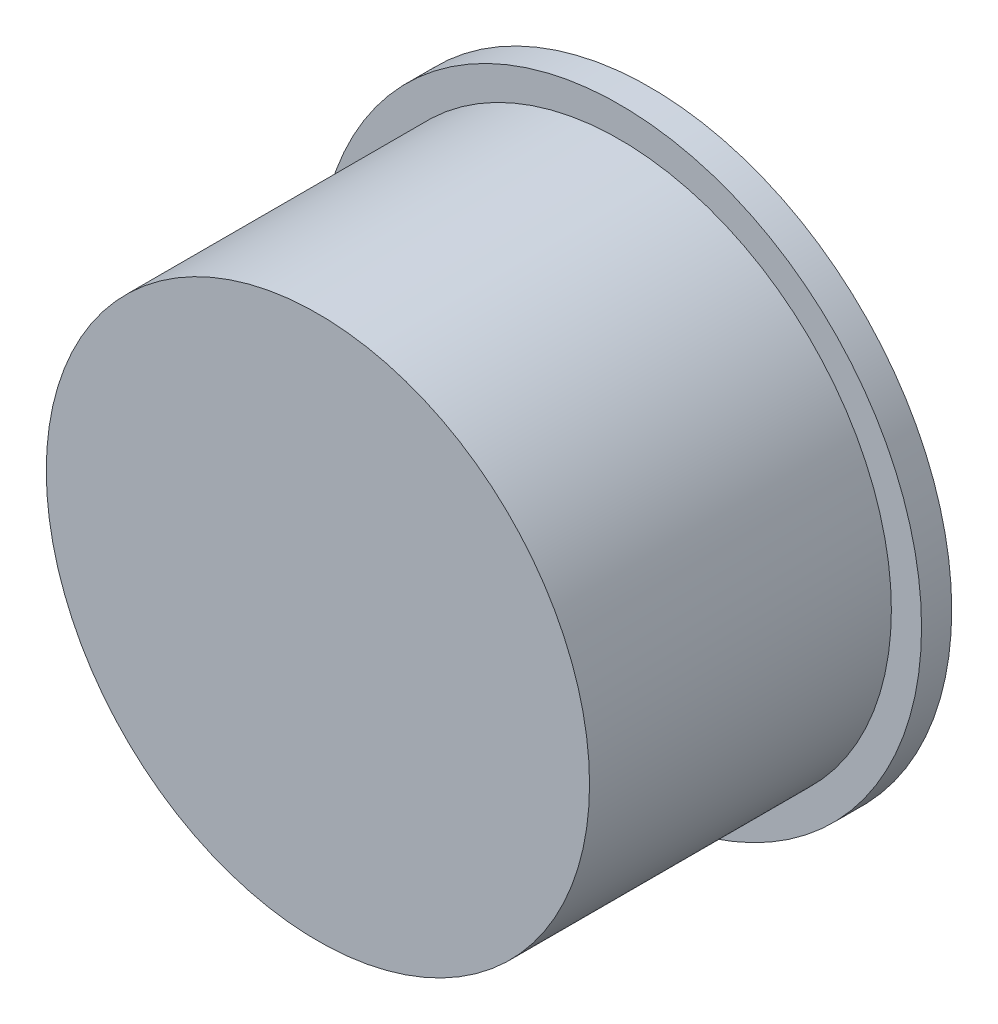
ISO-10303-21;
HEADER;
FILE_DESCRIPTION(('STEP AP214'),'2;1');
FILE_NAME('part.step','',(''),(''),'','','');
FILE_SCHEMA(('AUTOMOTIVE_DESIGN { 1 0 10303 214 1 1 1 1 }'));
ENDSEC;
DATA;
#1=APPLICATION_CONTEXT('core data for automotive mechanical design processes');
#2=APPLICATION_PROTOCOL_DEFINITION('international standard','automotive_design',2000,#1);
#3=PRODUCT_CONTEXT('',#1,'mechanical');
#4=PRODUCT('Part','Part','',(#3));
#5=PRODUCT_RELATED_PRODUCT_CATEGORY('part','',(#4));
#6=PRODUCT_DEFINITION_FORMATION('','',#4);
#7=PRODUCT_DEFINITION_CONTEXT('part definition',#1,'design');
#8=PRODUCT_DEFINITION('design','',#6,#7);
#9=PRODUCT_DEFINITION_SHAPE('','',#8);
#10=(LENGTH_UNIT() NAMED_UNIT(*) SI_UNIT(.MILLI.,.METRE.));
#11=(NAMED_UNIT(*) PLANE_ANGLE_UNIT() SI_UNIT($,.RADIAN.));
#12=(NAMED_UNIT(*) SI_UNIT($,.STERADIAN.) SOLID_ANGLE_UNIT());
#13=UNCERTAINTY_MEASURE_WITH_UNIT(LENGTH_MEASURE(1.E-05),#10,'distance_accuracy_value','');
#14=(GEOMETRIC_REPRESENTATION_CONTEXT(3) GLOBAL_UNCERTAINTY_ASSIGNED_CONTEXT((#13)) GLOBAL_UNIT_ASSIGNED_CONTEXT((#10,
#11,#12)) REPRESENTATION_CONTEXT('',''));
#15=CARTESIAN_POINT('',(0.,0.,0.));
#16=DIRECTION('',(0.,0.,1.));
#17=DIRECTION('',(1.,0.,0.));
#18=AXIS2_PLACEMENT_3D('',#15,#16,#17);
#19=CARTESIAN_POINT('',(0.,0.,5.08));
#20=DIRECTION('',(0.,0.,-1.));
#21=DIRECTION('',(-1.,0.,0.));
#22=AXIS2_PLACEMENT_3D('',#19,#20,#21);
#23=CYLINDRICAL_SURFACE('',#22,17.78);
#24=CARTESIAN_POINT('',(0.,0.,5.08));
#25=DIRECTION('',(0.,0.,1.));
#26=DIRECTION('',(1.,0.,0.));
#27=AXIS2_PLACEMENT_3D('',#24,#25,#26);
#28=CIRCLE('',#27,17.78);
#29=CARTESIAN_POINT('',(17.78,0.,5.08));
#30=VERTEX_POINT('',#29);
#31=EDGE_CURVE('E45',#30,#30,#28,.T.);
#32=ORIENTED_EDGE('',*,*,#31,.F.);
#33=EDGE_LOOP('',(#32));
#34=FACE_BOUND('',#33,.T.);
#35=CARTESIAN_POINT('',(0.,0.,0.));
#36=DIRECTION('',(0.,0.,1.));
#37=DIRECTION('',(1.,0.,0.));
#38=AXIS2_PLACEMENT_3D('',#35,#36,#37);
#39=CIRCLE('',#38,17.78);
#40=CARTESIAN_POINT('',(17.78,0.,0.));
#41=VERTEX_POINT('',#40);
#42=EDGE_CURVE('E40',#41,#41,#39,.T.);
#43=ORIENTED_EDGE('',*,*,#42,.T.);
#44=EDGE_LOOP('',(#43));
#45=FACE_BOUND('',#44,.T.);
#46=ADVANCED_FACE('F37',(#34,#45),#23,.T.);
#47=CARTESIAN_POINT('',(0.,0.,0.));
#48=DIRECTION('',(0.,0.,1.));
#49=DIRECTION('',(1.,0.,0.));
#50=AXIS2_PLACEMENT_3D('',#47,#48,#49);
#51=PLANE('',#50);
#52=ORIENTED_EDGE('',*,*,#42,.F.);
#53=EDGE_LOOP('',(#52));
#54=FACE_BOUND('',#53,.T.);
#55=ADVANCED_FACE('F83',(#54),#51,.F.);
#56=CARTESIAN_POINT('',(0.,0.,10.16));
#57=DIRECTION('',(0.,0.,-1.));
#58=DIRECTION('',(-1.,0.,0.));
#59=AXIS2_PLACEMENT_3D('',#56,#57,#58);
#60=CYLINDRICAL_SURFACE('',#59,50.8);
#61=CARTESIAN_POINT('',(0.,0.,10.16));
#62=DIRECTION('',(0.,0.,1.));
#63=DIRECTION('',(1.,0.,0.));
#64=AXIS2_PLACEMENT_3D('',#61,#62,#63);
#65=CIRCLE('',#64,50.8);
#66=CARTESIAN_POINT('',(50.8,0.,10.16));
#67=VERTEX_POINT('',#66);
#68=EDGE_CURVE('E54',#67,#67,#65,.T.);
#69=ORIENTED_EDGE('',*,*,#68,.F.);
#70=EDGE_LOOP('',(#69));
#71=FACE_BOUND('',#70,.T.);
#72=CARTESIAN_POINT('',(0.,0.,5.08));
#73=DIRECTION('',(0.,0.,1.));
#74=DIRECTION('',(1.,0.,0.));
#75=AXIS2_PLACEMENT_3D('',#72,#73,#74);
#76=CIRCLE('',#75,50.8);
#77=CARTESIAN_POINT('',(50.8,0.,5.08));
#78=VERTEX_POINT('',#77);
#79=EDGE_CURVE('E58',#78,#78,#76,.T.);
#80=ORIENTED_EDGE('',*,*,#79,.T.);
#81=EDGE_LOOP('',(#80));
#82=FACE_BOUND('',#81,.T.);
#83=ADVANCED_FACE('F88',(#71,#82),#60,.T.);
#84=CARTESIAN_POINT('',(0.,0.,10.16));
#85=DIRECTION('',(0.,0.,1.));
#86=DIRECTION('',(1.,0.,0.));
#87=AXIS2_PLACEMENT_3D('',#84,#85,#86);
#88=PLANE('',#87);
#89=CARTESIAN_POINT('',(0.,0.,10.16));
#90=DIRECTION('',(0.,0.,1.));
#91=DIRECTION('',(1.,0.,0.));
#92=AXIS2_PLACEMENT_3D('',#89,#90,#91);
#93=CIRCLE('',#92,45.72);
#94=CARTESIAN_POINT('',(45.72,0.,10.16));
#95=VERTEX_POINT('',#94);
#96=EDGE_CURVE('E10',#95,#95,#93,.T.);
#97=ORIENTED_EDGE('',*,*,#96,.F.);
#98=EDGE_LOOP('',(#97));
#99=FACE_BOUND('',#98,.T.);
#100=ORIENTED_EDGE('',*,*,#68,.T.);
#101=EDGE_LOOP('',(#100));
#102=FACE_BOUND('',#101,.T.);
#103=ADVANCED_FACE('F78',(#99,#102),#88,.T.);
#104=CARTESIAN_POINT('',(0.,0.,5.08));
#105=DIRECTION('',(0.,0.,1.));
#106=DIRECTION('',(1.,0.,0.));
#107=AXIS2_PLACEMENT_3D('',#104,#105,#106);
#108=PLANE('',#107);
#109=ORIENTED_EDGE('',*,*,#31,.T.);
#110=EDGE_LOOP('',(#109));
#111=FACE_BOUND('',#110,.T.);
#112=ORIENTED_EDGE('',*,*,#79,.F.);
#113=EDGE_LOOP('',(#112));
#114=FACE_BOUND('',#113,.T.);
#115=ADVANCED_FACE('F71',(#111,#114),#108,.F.);
#116=CARTESIAN_POINT('',(0.,0.,60.96));
#117=DIRECTION('',(0.,0.,-1.));
#118=DIRECTION('',(-1.,0.,0.));
#119=AXIS2_PLACEMENT_3D('',#116,#117,#118);
#120=CYLINDRICAL_SURFACE('',#119,45.72);
#121=CARTESIAN_POINT('',(0.,0.,60.96));
#122=DIRECTION('',(0.,0.,1.));
#123=DIRECTION('',(1.,0.,0.));
#124=AXIS2_PLACEMENT_3D('',#121,#122,#123);
#125=CIRCLE('',#124,45.72);
#126=CARTESIAN_POINT('',(45.72,0.,60.96));
#127=VERTEX_POINT('',#126);
#128=EDGE_CURVE('E53',#127,#127,#125,.T.);
#129=ORIENTED_EDGE('',*,*,#128,.F.);
#130=EDGE_LOOP('',(#129));
#131=FACE_BOUND('',#130,.T.);
#132=ORIENTED_EDGE('',*,*,#96,.T.);
#133=EDGE_LOOP('',(#132));
#134=FACE_BOUND('',#133,.T.);
#135=ADVANCED_FACE('F69',(#131,#134),#120,.T.);
#136=CARTESIAN_POINT('',(0.,0.,60.96));
#137=DIRECTION('',(0.,0.,1.));
#138=DIRECTION('',(1.,0.,0.));
#139=AXIS2_PLACEMENT_3D('',#136,#137,#138);
#140=PLANE('',#139);
#141=ORIENTED_EDGE('',*,*,#128,.T.);
#142=EDGE_LOOP('',(#141));
#143=FACE_BOUND('',#142,.T.);
#144=ADVANCED_FACE('F67',(#143),#140,.T.);
#145=CLOSED_SHELL('',(#46,#55,#83,#103,#115,#135,#144));
#146=MANIFOLD_SOLID_BREP('B2',#145);
#147=ADVANCED_BREP_SHAPE_REPRESENTATION('',(#18,#146),#14);
#148=SHAPE_DEFINITION_REPRESENTATION(#9,#147);
ENDSEC;
END-ISO-10303-21;
